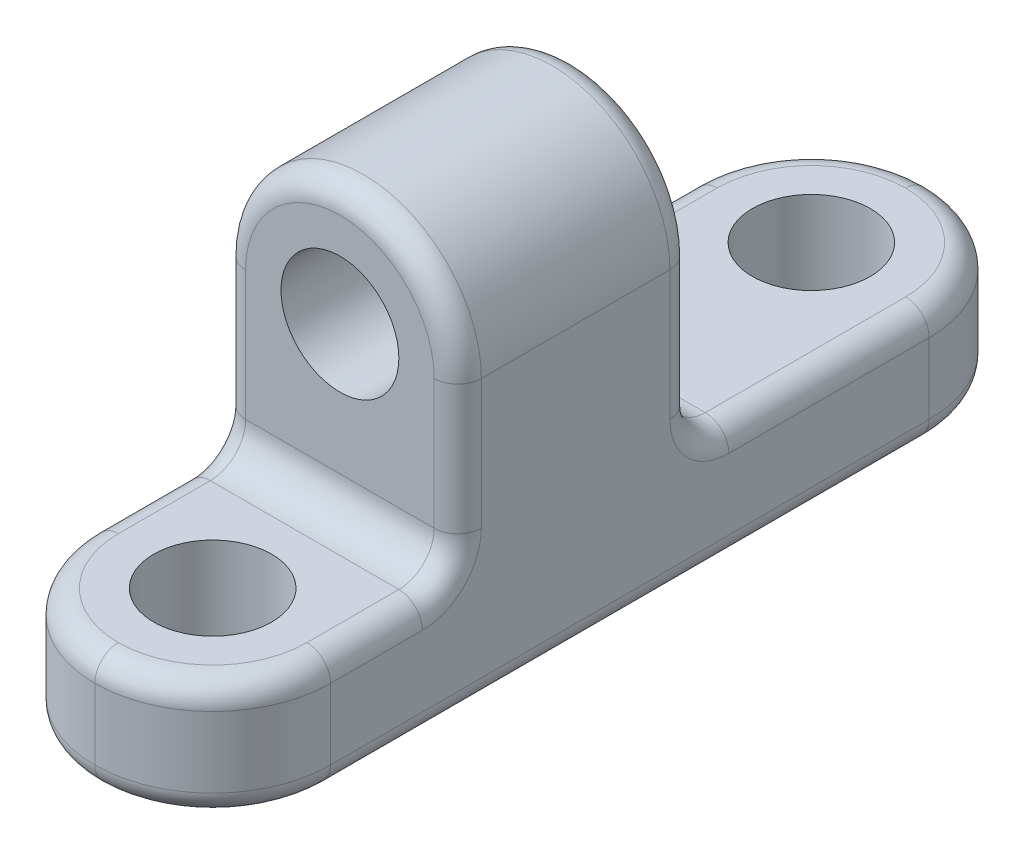
ISO-10303-21;
HEADER;
FILE_DESCRIPTION(('STEP AP214'),'2;1');
FILE_NAME('part.step','',(''),(''),'','','');
FILE_SCHEMA(('AUTOMOTIVE_DESIGN { 1 0 10303 214 1 1 1 1 }'));
ENDSEC;
DATA;
#1=APPLICATION_CONTEXT('core data for automotive mechanical design processes');
#2=APPLICATION_PROTOCOL_DEFINITION('international standard','automotive_design',2000,#1);
#3=PRODUCT_CONTEXT('',#1,'mechanical');
#4=PRODUCT('Part','Part','',(#3));
#5=PRODUCT_RELATED_PRODUCT_CATEGORY('part','',(#4));
#6=PRODUCT_DEFINITION_FORMATION('','',#4);
#7=PRODUCT_DEFINITION_CONTEXT('part definition',#1,'design');
#8=PRODUCT_DEFINITION('design','',#6,#7);
#9=PRODUCT_DEFINITION_SHAPE('','',#8);
#10=(LENGTH_UNIT() NAMED_UNIT(*) SI_UNIT(.MILLI.,.METRE.));
#11=(NAMED_UNIT(*) PLANE_ANGLE_UNIT() SI_UNIT($,.RADIAN.));
#12=(NAMED_UNIT(*) SI_UNIT($,.STERADIAN.) SOLID_ANGLE_UNIT());
#13=UNCERTAINTY_MEASURE_WITH_UNIT(LENGTH_MEASURE(1.E-05),#10,'distance_accuracy_value','');
#14=(GEOMETRIC_REPRESENTATION_CONTEXT(3) GLOBAL_UNCERTAINTY_ASSIGNED_CONTEXT((#13)) GLOBAL_UNIT_ASSIGNED_CONTEXT((#10,
#11,#12)) REPRESENTATION_CONTEXT('',''));
#15=CARTESIAN_POINT('',(0.,0.,0.));
#16=DIRECTION('',(0.,0.,1.));
#17=DIRECTION('',(1.,0.,0.));
#18=AXIS2_PLACEMENT_3D('',#15,#16,#17);
#19=CARTESIAN_POINT('',(0.,0.,10.));
#20=DIRECTION('',(0.,0.,1.));
#21=DIRECTION('',(1.,0.,0.));
#22=AXIS2_PLACEMENT_3D('',#19,#20,#21);
#23=PLANE('',#22);
#24=CARTESIAN_POINT('',(0.,0.,10.));
#25=DIRECTION('',(0.,0.,1.));
#26=DIRECTION('',(1.,0.,0.));
#27=AXIS2_PLACEMENT_3D('',#24,#25,#26);
#28=CIRCLE('',#27,2.5);
#29=CARTESIAN_POINT('',(2.5,0.,10.));
#30=VERTEX_POINT('',#29);
#31=EDGE_CURVE('E994',#30,#30,#28,.T.);
#32=ORIENTED_EDGE('',*,*,#31,.F.);
#33=EDGE_LOOP('',(#32));
#34=FACE_BOUND('',#33,.T.);
#35=DIRECTION('',(1.,0.,0.));
#36=VECTOR('',#35,1.);
#37=CARTESIAN_POINT('',(5.,-5.5,10.));
#38=LINE('',#37,#36);
#39=CARTESIAN_POINT('',(-4.,-5.5,10.));
#40=VERTEX_POINT('',#39);
#41=CARTESIAN_POINT('',(4.,-5.5,10.));
#42=VERTEX_POINT('',#41);
#43=EDGE_CURVE('E484',#40,#42,#38,.T.);
#44=ORIENTED_EDGE('',*,*,#43,.T.);
#45=DIRECTION('',(0.,-1.,0.));
#46=VECTOR('',#45,1.);
#47=CARTESIAN_POINT('',(4.,0.,10.));
#48=LINE('',#47,#46);
#49=CARTESIAN_POINT('',(4.,0.,10.));
#50=VERTEX_POINT('',#49);
#51=EDGE_CURVE('E311',#42,#50,#48,.F.);
#52=ORIENTED_EDGE('',*,*,#51,.T.);
#53=CARTESIAN_POINT('',(0.,0.,10.));
#54=DIRECTION('',(0.,0.,1.));
#55=DIRECTION('',(1.,0.,0.));
#56=AXIS2_PLACEMENT_3D('',#53,#54,#55);
#57=CIRCLE('',#56,4.);
#58=CARTESIAN_POINT('',(-4.,0.,10.));
#59=VERTEX_POINT('',#58);
#60=EDGE_CURVE('E308',#50,#59,#57,.T.);
#61=ORIENTED_EDGE('',*,*,#60,.T.);
#62=DIRECTION('',(0.,-1.,0.));
#63=VECTOR('',#62,1.);
#64=CARTESIAN_POINT('',(-4.,-5.5,10.));
#65=LINE('',#64,#63);
#66=EDGE_CURVE('E305',#59,#40,#65,.T.);
#67=ORIENTED_EDGE('',*,*,#66,.T.);
#68=EDGE_LOOP('',(#44,#52,#61,#67));
#69=FACE_BOUND('',#68,.T.);
#70=ADVANCED_FACE('F43',(#34,#69),#23,.T.);
#71=CARTESIAN_POINT('',(5.,0.,10.));
#72=DIRECTION('',(1.,0.,0.));
#73=DIRECTION('',(0.,1.,0.));
#74=AXIS2_PLACEMENT_3D('',#71,#72,#73);
#75=PLANE('',#74);
#76=DIRECTION('',(0.,-1.,0.));
#77=VECTOR('',#76,1.);
#78=CARTESIAN_POINT('',(5.,0.,15.4));
#79=LINE('',#78,#77);
#80=CARTESIAN_POINT('',(5.,-8.,15.4));
#81=VERTEX_POINT('',#80);
#82=CARTESIAN_POINT('',(5.,-11.,15.4));
#83=VERTEX_POINT('',#82);
#84=EDGE_CURVE('E470',#81,#83,#79,.T.);
#85=ORIENTED_EDGE('',*,*,#84,.T.);
#86=DIRECTION('',(0.,0.,-1.));
#87=VECTOR('',#86,1.);
#88=CARTESIAN_POINT('',(5.,-11.,10.));
#89=LINE('',#88,#87);
#90=CARTESIAN_POINT('',(5.,-11.,-10.));
#91=VERTEX_POINT('',#90);
#92=EDGE_CURVE('E271',#83,#91,#89,.T.);
#93=ORIENTED_EDGE('',*,*,#92,.T.);
#94=DIRECTION('',(0.,-1.,0.));
#95=VECTOR('',#94,1.);
#96=CARTESIAN_POINT('',(5.,0.,-10.));
#97=LINE('',#96,#95);
#98=CARTESIAN_POINT('',(5.,-8.,-10.));
#99=VERTEX_POINT('',#98);
#100=EDGE_CURVE('E464',#91,#99,#97,.F.);
#101=ORIENTED_EDGE('',*,*,#100,.T.);
#102=DIRECTION('',(0.,0.,1.));
#103=VECTOR('',#102,1.);
#104=CARTESIAN_POINT('',(5.,-8.,-1.5));
#105=LINE('',#104,#103);
#106=CARTESIAN_POINT('',(5.,-8.,-1.5));
#107=VERTEX_POINT('',#106);
#108=EDGE_CURVE('E253',#99,#107,#105,.T.);
#109=ORIENTED_EDGE('',*,*,#108,.T.);
#110=CARTESIAN_POINT('',(5.,-5.5,-1.5));
#111=DIRECTION('',(1.,0.,0.));
#112=DIRECTION('',(0.,1.,0.));
#113=AXIS2_PLACEMENT_3D('',#110,#111,#112);
#114=CIRCLE('',#113,2.5);
#115=CARTESIAN_POINT('',(5.,-5.5,1.));
#116=VERTEX_POINT('',#115);
#117=EDGE_CURVE('E256',#107,#116,#114,.F.);
#118=ORIENTED_EDGE('',*,*,#117,.T.);
#119=DIRECTION('',(0.,-1.,0.));
#120=VECTOR('',#119,1.);
#121=CARTESIAN_POINT('',(5.,0.,1.));
#122=LINE('',#121,#120);
#123=CARTESIAN_POINT('',(5.,0.,0.999999999999999));
#124=VERTEX_POINT('',#123);
#125=EDGE_CURVE('E259',#116,#124,#122,.F.);
#126=ORIENTED_EDGE('',*,*,#125,.T.);
#127=DIRECTION('',(0.,0.,-1.));
#128=VECTOR('',#127,1.);
#129=CARTESIAN_POINT('',(5.,0.,10.));
#130=LINE('',#129,#128);
#131=CARTESIAN_POINT('',(5.,0.,9.));
#132=VERTEX_POINT('',#131);
#133=EDGE_CURVE('E477',#132,#124,#130,.T.);
#134=ORIENTED_EDGE('',*,*,#133,.F.);
#135=DIRECTION('',(0.,-1.,0.));
#136=VECTOR('',#135,1.);
#137=CARTESIAN_POINT('',(5.,0.,9.));
#138=LINE('',#137,#136);
#139=CARTESIAN_POINT('',(5.,-5.5,9.));
#140=VERTEX_POINT('',#139);
#141=EDGE_CURVE('E262',#132,#140,#138,.T.);
#142=ORIENTED_EDGE('',*,*,#141,.T.);
#143=CARTESIAN_POINT('',(5.,-5.5,11.5));
#144=DIRECTION('',(1.,0.,0.));
#145=DIRECTION('',(0.,1.,0.));
#146=AXIS2_PLACEMENT_3D('',#143,#144,#145);
#147=CIRCLE('',#146,2.5);
#148=CARTESIAN_POINT('',(5.,-8.,11.5));
#149=VERTEX_POINT('',#148);
#150=EDGE_CURVE('E265',#140,#149,#147,.F.);
#151=ORIENTED_EDGE('',*,*,#150,.T.);
#152=DIRECTION('',(0.,0.,1.));
#153=VECTOR('',#152,1.);
#154=CARTESIAN_POINT('',(5.,-8.,10.));
#155=LINE('',#154,#153);
#156=EDGE_CURVE('E268',#149,#81,#155,.T.);
#157=ORIENTED_EDGE('',*,*,#156,.T.);
#158=EDGE_LOOP('',(#85,#93,#101,#109,#118,#126,#134,#142,#151,#157));
#159=FACE_BOUND('',#158,.T.);
#160=ADVANCED_FACE('F459',(#159),#75,.T.);
#161=CARTESIAN_POINT('',(0.,0.,10.));
#162=DIRECTION('',(0.,0.,-1.));
#163=DIRECTION('',(-1.,0.,0.));
#164=AXIS2_PLACEMENT_3D('',#161,#162,#163);
#165=CYLINDRICAL_SURFACE('',#164,5.);
#166=DIRECTION('',(0.,0.,-1.));
#167=VECTOR('',#166,1.);
#168=CARTESIAN_POINT('',(-5.,0.,10.));
#169=LINE('',#168,#167);
#170=CARTESIAN_POINT('',(-5.,0.,9.));
#171=VERTEX_POINT('',#170);
#172=CARTESIAN_POINT('',(-5.,0.,0.999999999999999));
#173=VERTEX_POINT('',#172);
#174=EDGE_CURVE('E1004',#171,#173,#169,.T.);
#175=ORIENTED_EDGE('',*,*,#174,.F.);
#176=CARTESIAN_POINT('',(0.,0.,9.));
#177=DIRECTION('',(0.,0.,1.));
#178=DIRECTION('',(1.,0.,0.));
#179=AXIS2_PLACEMENT_3D('',#176,#177,#178);
#180=CIRCLE('',#179,5.);
#181=EDGE_CURVE('E317',#171,#132,#180,.F.);
#182=ORIENTED_EDGE('',*,*,#181,.T.);
#183=ORIENTED_EDGE('',*,*,#133,.T.);
#184=CARTESIAN_POINT('',(0.,0.,0.999999999999999));
#185=DIRECTION('',(0.,0.,1.));
#186=DIRECTION('',(1.,0.,0.));
#187=AXIS2_PLACEMENT_3D('',#184,#185,#186);
#188=CIRCLE('',#187,5.);
#189=EDGE_CURVE('E314',#124,#173,#188,.T.);
#190=ORIENTED_EDGE('',*,*,#189,.T.);
#191=EDGE_LOOP('',(#175,#182,#183,#190));
#192=FACE_BOUND('',#191,.T.);
#193=ADVANCED_FACE('F602',(#192),#165,.T.);
#194=CARTESIAN_POINT('',(-5.,0.,10.));
#195=DIRECTION('',(1.,0.,0.));
#196=DIRECTION('',(0.,1.,0.));
#197=AXIS2_PLACEMENT_3D('',#194,#195,#196);
#198=PLANE('',#197);
#199=DIRECTION('',(0.,-1.,0.));
#200=VECTOR('',#199,1.);
#201=CARTESIAN_POINT('',(-5.,-12.,-10.));
#202=LINE('',#201,#200);
#203=CARTESIAN_POINT('',(-5.,-8.,-10.));
#204=VERTEX_POINT('',#203);
#205=CARTESIAN_POINT('',(-5.,-11.,-10.));
#206=VERTEX_POINT('',#205);
#207=EDGE_CURVE('E469',#204,#206,#202,.T.);
#208=ORIENTED_EDGE('',*,*,#207,.T.);
#209=DIRECTION('',(0.,0.,-1.));
#210=VECTOR('',#209,1.);
#211=CARTESIAN_POINT('',(-5.,-11.,15.4));
#212=LINE('',#211,#210);
#213=CARTESIAN_POINT('',(-5.,-11.,15.4));
#214=VERTEX_POINT('',#213);
#215=EDGE_CURVE('E339',#206,#214,#212,.F.);
#216=ORIENTED_EDGE('',*,*,#215,.T.);
#217=DIRECTION('',(0.,-1.,0.));
#218=VECTOR('',#217,1.);
#219=CARTESIAN_POINT('',(-5.,-7.,15.4));
#220=LINE('',#219,#218);
#221=CARTESIAN_POINT('',(-5.,-8.,15.4));
#222=VERTEX_POINT('',#221);
#223=EDGE_CURVE('E475',#214,#222,#220,.F.);
#224=ORIENTED_EDGE('',*,*,#223,.T.);
#225=DIRECTION('',(0.,0.,-1.));
#226=VECTOR('',#225,1.);
#227=CARTESIAN_POINT('',(-5.,-8.,11.5));
#228=LINE('',#227,#226);
#229=CARTESIAN_POINT('',(-5.,-8.,11.5));
#230=VERTEX_POINT('',#229);
#231=EDGE_CURVE('E330',#222,#230,#228,.T.);
#232=ORIENTED_EDGE('',*,*,#231,.T.);
#233=CARTESIAN_POINT('',(-5.,-5.5,11.5));
#234=DIRECTION('',(1.,0.,0.));
#235=DIRECTION('',(0.,1.,0.));
#236=AXIS2_PLACEMENT_3D('',#233,#234,#235);
#237=CIRCLE('',#236,2.5);
#238=CARTESIAN_POINT('',(-5.,-5.5,9.));
#239=VERTEX_POINT('',#238);
#240=EDGE_CURVE('E333',#230,#239,#237,.T.);
#241=ORIENTED_EDGE('',*,*,#240,.T.);
#242=DIRECTION('',(0.,-1.,0.));
#243=VECTOR('',#242,1.);
#244=CARTESIAN_POINT('',(-5.,0.,9.));
#245=LINE('',#244,#243);
#246=EDGE_CURVE('E336',#239,#171,#245,.F.);
#247=ORIENTED_EDGE('',*,*,#246,.T.);
#248=ORIENTED_EDGE('',*,*,#174,.T.);
#249=DIRECTION('',(0.,-1.,0.));
#250=VECTOR('',#249,1.);
#251=CARTESIAN_POINT('',(-5.,0.,0.999999999999999));
#252=LINE('',#251,#250);
#253=CARTESIAN_POINT('',(-5.,-5.5,1.));
#254=VERTEX_POINT('',#253);
#255=EDGE_CURVE('E327',#173,#254,#252,.T.);
#256=ORIENTED_EDGE('',*,*,#255,.T.);
#257=CARTESIAN_POINT('',(-5.,-5.5,-1.5));
#258=DIRECTION('',(1.,0.,0.));
#259=DIRECTION('',(0.,1.,0.));
#260=AXIS2_PLACEMENT_3D('',#257,#258,#259);
#261=CIRCLE('',#260,2.5);
#262=CARTESIAN_POINT('',(-5.,-8.,-1.5));
#263=VERTEX_POINT('',#262);
#264=EDGE_CURVE('E323',#254,#263,#261,.T.);
#265=ORIENTED_EDGE('',*,*,#264,.T.);
#266=DIRECTION('',(0.,0.,-1.));
#267=VECTOR('',#266,1.);
#268=CARTESIAN_POINT('',(-5.,-8.,10.));
#269=LINE('',#268,#267);
#270=EDGE_CURVE('E320',#263,#204,#269,.T.);
#271=ORIENTED_EDGE('',*,*,#270,.T.);
#272=EDGE_LOOP('',(#208,#216,#224,#232,#241,#247,#248,#256,#265,#271));
#273=FACE_BOUND('',#272,.T.);
#274=ADVANCED_FACE('F540',(#273),#198,.F.);
#275=CARTESIAN_POINT('',(0.,0.,10.));
#276=DIRECTION('',(0.,0.,-1.));
#277=DIRECTION('',(-1.,0.,0.));
#278=AXIS2_PLACEMENT_3D('',#275,#276,#277);
#279=CYLINDRICAL_SURFACE('',#278,2.5);
#280=ORIENTED_EDGE('',*,*,#31,.T.);
#281=EDGE_LOOP('',(#280));
#282=FACE_BOUND('',#281,.T.);
#283=CARTESIAN_POINT('',(0.,0.,0.));
#284=DIRECTION('',(0.,0.,1.));
#285=DIRECTION('',(1.,0.,0.));
#286=AXIS2_PLACEMENT_3D('',#283,#284,#285);
#287=CIRCLE('',#286,2.5);
#288=CARTESIAN_POINT('',(2.5,0.,0.));
#289=VERTEX_POINT('',#288);
#290=EDGE_CURVE('E988',#289,#289,#287,.T.);
#291=ORIENTED_EDGE('',*,*,#290,.F.);
#292=EDGE_LOOP('',(#291));
#293=FACE_BOUND('',#292,.T.);
#294=ADVANCED_FACE('F614',(#282,#293),#279,.F.);
#295=CARTESIAN_POINT('',(0.,-12.,10.));
#296=DIRECTION('',(0.,-1.,0.));
#297=DIRECTION('',(0.,0.,-1.));
#298=AXIS2_PLACEMENT_3D('',#295,#296,#297);
#299=PLANE('',#298);
#300=CARTESIAN_POINT('',(0.,-12.,15.4));
#301=DIRECTION('',(0.,-1.,0.));
#302=DIRECTION('',(0.,0.,-1.));
#303=AXIS2_PLACEMENT_3D('',#300,#301,#302);
#304=CIRCLE('',#303,4.);
#305=CARTESIAN_POINT('',(4.,-12.,15.4));
#306=VERTEX_POINT('',#305);
#307=CARTESIAN_POINT('',(0.,-12.,19.4));
#308=VERTEX_POINT('',#307);
#309=EDGE_CURVE('E232',#306,#308,#304,.T.);
#310=ORIENTED_EDGE('',*,*,#309,.T.);
#311=CARTESIAN_POINT('',(0.,-12.,15.4));
#312=DIRECTION('',(0.,-1.,0.));
#313=DIRECTION('',(0.,0.,-1.));
#314=AXIS2_PLACEMENT_3D('',#311,#312,#313);
#315=CIRCLE('',#314,4.);
#316=CARTESIAN_POINT('',(-4.,-12.,15.4));
#317=VERTEX_POINT('',#316);
#318=EDGE_CURVE('E209',#308,#317,#315,.T.);
#319=ORIENTED_EDGE('',*,*,#318,.T.);
#320=DIRECTION('',(0.,0.,-1.));
#321=VECTOR('',#320,1.);
#322=CARTESIAN_POINT('',(-4.,-12.,-10.));
#323=LINE('',#322,#321);
#324=CARTESIAN_POINT('',(-4.,-12.,-10.));
#325=VERTEX_POINT('',#324);
#326=EDGE_CURVE('E219',#317,#325,#323,.T.);
#327=ORIENTED_EDGE('',*,*,#326,.T.);
#328=CARTESIAN_POINT('',(0.,-12.,-10.));
#329=DIRECTION('',(0.,-1.,0.));
#330=DIRECTION('',(0.,0.,-1.));
#331=AXIS2_PLACEMENT_3D('',#328,#329,#330);
#332=CIRCLE('',#331,4.);
#333=CARTESIAN_POINT('',(0.,-12.,-14.));
#334=VERTEX_POINT('',#333);
#335=EDGE_CURVE('E226',#325,#334,#332,.T.);
#336=ORIENTED_EDGE('',*,*,#335,.T.);
#337=CARTESIAN_POINT('',(0.,-12.,-10.));
#338=DIRECTION('',(0.,-1.,0.));
#339=DIRECTION('',(0.,0.,-1.));
#340=AXIS2_PLACEMENT_3D('',#337,#338,#339);
#341=CIRCLE('',#340,4.);
#342=CARTESIAN_POINT('',(4.,-12.,-10.));
#343=VERTEX_POINT('',#342);
#344=EDGE_CURVE('E508',#334,#343,#341,.T.);
#345=ORIENTED_EDGE('',*,*,#344,.T.);
#346=DIRECTION('',(0.,0.,-1.));
#347=VECTOR('',#346,1.);
#348=CARTESIAN_POINT('',(4.,-12.,10.));
#349=LINE('',#348,#347);
#350=EDGE_CURVE('E241',#343,#306,#349,.F.);
#351=ORIENTED_EDGE('',*,*,#350,.T.);
#352=EDGE_LOOP('',(#310,#319,#327,#336,#345,#351));
#353=FACE_BOUND('',#352,.T.);
#354=CARTESIAN_POINT('',(0.,-12.,-10.));
#355=DIRECTION('',(0.,-1.,0.));
#356=DIRECTION('',(0.,0.,-1.));
#357=AXIS2_PLACEMENT_3D('',#354,#355,#356);
#358=CIRCLE('',#357,2.5);
#359=CARTESIAN_POINT('',(0.,-12.,-12.5));
#360=VERTEX_POINT('',#359);
#361=EDGE_CURVE('E989',#360,#360,#358,.T.);
#362=ORIENTED_EDGE('',*,*,#361,.F.);
#363=EDGE_LOOP('',(#362));
#364=FACE_BOUND('',#363,.T.);
#365=CARTESIAN_POINT('',(0.,-12.,15.4));
#366=DIRECTION('',(0.,-1.,0.));
#367=DIRECTION('',(0.,0.,-1.));
#368=AXIS2_PLACEMENT_3D('',#365,#366,#367);
#369=CIRCLE('',#368,2.5);
#370=CARTESIAN_POINT('',(0.,-12.,12.9));
#371=VERTEX_POINT('',#370);
#372=EDGE_CURVE('E489',#371,#371,#369,.T.);
#373=ORIENTED_EDGE('',*,*,#372,.F.);
#374=EDGE_LOOP('',(#373));
#375=FACE_BOUND('',#374,.T.);
#376=ADVANCED_FACE('F229',(#353,#364,#375),#299,.T.);
#377=CARTESIAN_POINT('',(0.,0.,0.));
#378=DIRECTION('',(0.,0.,1.));
#379=DIRECTION('',(1.,0.,0.));
#380=AXIS2_PLACEMENT_3D('',#377,#378,#379);
#381=PLANE('',#380);
#382=ORIENTED_EDGE('',*,*,#290,.T.);
#383=EDGE_LOOP('',(#382));
#384=FACE_BOUND('',#383,.T.);
#385=DIRECTION('',(-1.,0.,0.));
#386=VECTOR('',#385,1.);
#387=CARTESIAN_POINT('',(-5.,-5.5,0.));
#388=LINE('',#387,#386);
#389=CARTESIAN_POINT('',(4.,-5.5,0.));
#390=VERTEX_POINT('',#389);
#391=CARTESIAN_POINT('',(-4.,-5.5,0.));
#392=VERTEX_POINT('',#391);
#393=EDGE_CURVE('E500',#390,#392,#388,.T.);
#394=ORIENTED_EDGE('',*,*,#393,.T.);
#395=DIRECTION('',(0.,-1.,0.));
#396=VECTOR('',#395,1.);
#397=CARTESIAN_POINT('',(-4.,0.,0.));
#398=LINE('',#397,#396);
#399=CARTESIAN_POINT('',(-4.,0.,0.));
#400=VERTEX_POINT('',#399);
#401=EDGE_CURVE('E355',#392,#400,#398,.F.);
#402=ORIENTED_EDGE('',*,*,#401,.T.);
#403=CARTESIAN_POINT('',(0.,0.,0.));
#404=DIRECTION('',(0.,0.,1.));
#405=DIRECTION('',(1.,0.,0.));
#406=AXIS2_PLACEMENT_3D('',#403,#404,#405);
#407=CIRCLE('',#406,4.);
#408=CARTESIAN_POINT('',(4.,0.,0.));
#409=VERTEX_POINT('',#408);
#410=EDGE_CURVE('E352',#400,#409,#407,.F.);
#411=ORIENTED_EDGE('',*,*,#410,.T.);
#412=DIRECTION('',(0.,-1.,0.));
#413=VECTOR('',#412,1.);
#414=CARTESIAN_POINT('',(4.,-5.5,0.));
#415=LINE('',#414,#413);
#416=EDGE_CURVE('E349',#409,#390,#415,.T.);
#417=ORIENTED_EDGE('',*,*,#416,.T.);
#418=EDGE_LOOP('',(#394,#402,#411,#417));
#419=FACE_BOUND('',#418,.T.);
#420=ADVANCED_FACE('F581',(#384,#419),#381,.F.);
#421=CARTESIAN_POINT('',(0.,-7.,0.));
#422=DIRECTION('',(0.,-1.,0.));
#423=DIRECTION('',(0.,0.,-1.));
#424=AXIS2_PLACEMENT_3D('',#421,#422,#423);
#425=PLANE('',#424);
#426=CARTESIAN_POINT('',(0.,-7.,-10.));
#427=DIRECTION('',(0.,-1.,0.));
#428=DIRECTION('',(0.,0.,-1.));
#429=AXIS2_PLACEMENT_3D('',#426,#427,#428);
#430=CIRCLE('',#429,2.5);
#431=CARTESIAN_POINT('',(0.,-7.,-12.5));
#432=VERTEX_POINT('',#431);
#433=EDGE_CURVE('E986',#432,#432,#430,.T.);
#434=ORIENTED_EDGE('',*,*,#433,.T.);
#435=EDGE_LOOP('',(#434));
#436=FACE_BOUND('',#435,.T.);
#437=DIRECTION('',(-1.,0.,0.));
#438=VECTOR('',#437,1.);
#439=CARTESIAN_POINT('',(5.,-7.,-1.5));
#440=LINE('',#439,#438);
#441=CARTESIAN_POINT('',(-4.,-7.,-1.5));
#442=VERTEX_POINT('',#441);
#443=CARTESIAN_POINT('',(4.,-7.,-1.5));
#444=VERTEX_POINT('',#443);
#445=EDGE_CURVE('E227',#442,#444,#440,.F.);
#446=ORIENTED_EDGE('',*,*,#445,.T.);
#447=DIRECTION('',(0.,0.,1.));
#448=VECTOR('',#447,1.);
#449=CARTESIAN_POINT('',(4.,-7.,-10.));
#450=LINE('',#449,#448);
#451=CARTESIAN_POINT('',(4.,-7.,-10.));
#452=VERTEX_POINT('',#451);
#453=EDGE_CURVE('E11',#444,#452,#450,.F.);
#454=ORIENTED_EDGE('',*,*,#453,.T.);
#455=CARTESIAN_POINT('',(0.,-7.,-10.));
#456=DIRECTION('',(0.,-1.,0.));
#457=DIRECTION('',(0.,0.,-1.));
#458=AXIS2_PLACEMENT_3D('',#455,#456,#457);
#459=CIRCLE('',#458,4.);
#460=CARTESIAN_POINT('',(0.,-7.,-14.));
#461=VERTEX_POINT('',#460);
#462=EDGE_CURVE('E53',#452,#461,#459,.F.);
#463=ORIENTED_EDGE('',*,*,#462,.T.);
#464=CARTESIAN_POINT('',(0.,-7.,-10.));
#465=DIRECTION('',(0.,-1.,0.));
#466=DIRECTION('',(0.,0.,-1.));
#467=AXIS2_PLACEMENT_3D('',#464,#465,#466);
#468=CIRCLE('',#467,4.);
#469=CARTESIAN_POINT('',(-4.,-7.,-10.));
#470=VERTEX_POINT('',#469);
#471=EDGE_CURVE('E361',#461,#470,#468,.F.);
#472=ORIENTED_EDGE('',*,*,#471,.T.);
#473=DIRECTION('',(0.,0.,-1.));
#474=VECTOR('',#473,1.);
#475=CARTESIAN_POINT('',(-4.,-7.,0.));
#476=LINE('',#475,#474);
#477=EDGE_CURVE('E358',#470,#442,#476,.F.);
#478=ORIENTED_EDGE('',*,*,#477,.T.);
#479=EDGE_LOOP('',(#446,#454,#463,#472,#478));
#480=FACE_BOUND('',#479,.T.);
#481=ADVANCED_FACE('F565',(#436,#480),#425,.F.);
#482=CARTESIAN_POINT('',(0.,-7.,-10.));
#483=DIRECTION('',(0.,-1.,0.));
#484=DIRECTION('',(0.,0.,-1.));
#485=AXIS2_PLACEMENT_3D('',#482,#483,#484);
#486=CYLINDRICAL_SURFACE('',#485,2.5);
#487=ORIENTED_EDGE('',*,*,#433,.F.);
#488=EDGE_LOOP('',(#487));
#489=FACE_BOUND('',#488,.T.);
#490=ORIENTED_EDGE('',*,*,#361,.T.);
#491=EDGE_LOOP('',(#490));
#492=FACE_BOUND('',#491,.T.);
#493=ADVANCED_FACE('F871',(#489,#492),#486,.F.);
#494=CARTESIAN_POINT('',(0.,-7.,0.));
#495=DIRECTION('',(0.,1.,0.));
#496=DIRECTION('',(0.,0.,1.));
#497=AXIS2_PLACEMENT_3D('',#494,#495,#496);
#498=PLANE('',#497);
#499=CARTESIAN_POINT('',(0.,-7.,15.4));
#500=DIRECTION('',(0.,-1.,0.));
#501=DIRECTION('',(0.,0.,-1.));
#502=AXIS2_PLACEMENT_3D('',#499,#500,#501);
#503=CIRCLE('',#502,2.5);
#504=CARTESIAN_POINT('',(0.,-7.,12.9));
#505=VERTEX_POINT('',#504);
#506=EDGE_CURVE('E997',#505,#505,#503,.T.);
#507=ORIENTED_EDGE('',*,*,#506,.T.);
#508=EDGE_LOOP('',(#507));
#509=FACE_BOUND('',#508,.T.);
#510=CARTESIAN_POINT('',(0.,-7.,15.4));
#511=DIRECTION('',(0.,1.,0.));
#512=DIRECTION('',(0.,0.,1.));
#513=AXIS2_PLACEMENT_3D('',#510,#511,#512);
#514=CIRCLE('',#513,4.);
#515=CARTESIAN_POINT('',(0.,-7.,19.4));
#516=VERTEX_POINT('',#515);
#517=CARTESIAN_POINT('',(4.,-7.,15.4));
#518=VERTEX_POINT('',#517);
#519=EDGE_CURVE('E293',#516,#518,#514,.T.);
#520=ORIENTED_EDGE('',*,*,#519,.T.);
#521=DIRECTION('',(0.,0.,1.));
#522=VECTOR('',#521,1.);
#523=CARTESIAN_POINT('',(4.,-7.,0.));
#524=LINE('',#523,#522);
#525=CARTESIAN_POINT('',(4.,-7.,11.5));
#526=VERTEX_POINT('',#525);
#527=EDGE_CURVE('E296',#518,#526,#524,.F.);
#528=ORIENTED_EDGE('',*,*,#527,.T.);
#529=DIRECTION('',(1.,0.,0.));
#530=VECTOR('',#529,1.);
#531=CARTESIAN_POINT('',(-5.,-7.,11.5));
#532=LINE('',#531,#530);
#533=CARTESIAN_POINT('',(-4.,-7.,11.5));
#534=VERTEX_POINT('',#533);
#535=EDGE_CURVE('E496',#526,#534,#532,.F.);
#536=ORIENTED_EDGE('',*,*,#535,.T.);
#537=DIRECTION('',(0.,0.,-1.));
#538=VECTOR('',#537,1.);
#539=CARTESIAN_POINT('',(-4.,-7.,15.4));
#540=LINE('',#539,#538);
#541=CARTESIAN_POINT('',(-4.,-7.,15.4));
#542=VERTEX_POINT('',#541);
#543=EDGE_CURVE('E286',#534,#542,#540,.F.);
#544=ORIENTED_EDGE('',*,*,#543,.T.);
#545=CARTESIAN_POINT('',(0.,-7.,15.4));
#546=DIRECTION('',(0.,1.,0.));
#547=DIRECTION('',(0.,0.,1.));
#548=AXIS2_PLACEMENT_3D('',#545,#546,#547);
#549=CIRCLE('',#548,4.);
#550=EDGE_CURVE('E289',#542,#516,#549,.T.);
#551=ORIENTED_EDGE('',*,*,#550,.T.);
#552=EDGE_LOOP('',(#520,#528,#536,#544,#551));
#553=FACE_BOUND('',#552,.T.);
#554=ADVANCED_FACE('F862',(#509,#553),#498,.T.);
#555=CARTESIAN_POINT('',(0.,-7.,15.4));
#556=DIRECTION('',(0.,-1.,0.));
#557=DIRECTION('',(0.,0.,-1.));
#558=AXIS2_PLACEMENT_3D('',#555,#556,#557);
#559=CYLINDRICAL_SURFACE('',#558,2.5);
#560=ORIENTED_EDGE('',*,*,#506,.F.);
#561=EDGE_LOOP('',(#560));
#562=FACE_BOUND('',#561,.T.);
#563=ORIENTED_EDGE('',*,*,#372,.T.);
#564=EDGE_LOOP('',(#563));
#565=FACE_BOUND('',#564,.T.);
#566=ADVANCED_FACE('F627',(#562,#565),#559,.F.);
#567=CARTESIAN_POINT('',(0.,0.,-10.));
#568=DIRECTION('',(0.,1.,0.));
#569=DIRECTION('',(-1.,0.,0.));
#570=AXIS2_PLACEMENT_3D('',#567,#568,#569);
#571=CYLINDRICAL_SURFACE('',#570,5.);
#572=DIRECTION('',(0.,-1.,0.));
#573=VECTOR('',#572,1.);
#574=CARTESIAN_POINT('',(0.,-7.,-15.));
#575=LINE('',#574,#573);
#576=CARTESIAN_POINT('',(0.,-11.,-15.));
#577=VERTEX_POINT('',#576);
#578=CARTESIAN_POINT('',(0.,-8.,-15.));
#579=VERTEX_POINT('',#578);
#580=EDGE_CURVE('E485',#577,#579,#575,.F.);
#581=ORIENTED_EDGE('',*,*,#580,.F.);
#582=CARTESIAN_POINT('',(0.,-11.,-10.));
#583=DIRECTION('',(0.,-1.,0.));
#584=DIRECTION('',(0.,0.,-1.));
#585=AXIS2_PLACEMENT_3D('',#582,#583,#584);
#586=CIRCLE('',#585,5.);
#587=EDGE_CURVE('E283',#577,#206,#586,.F.);
#588=ORIENTED_EDGE('',*,*,#587,.T.);
#589=ORIENTED_EDGE('',*,*,#207,.F.);
#590=CARTESIAN_POINT('',(0.,-8.,-10.));
#591=DIRECTION('',(0.,-1.,0.));
#592=DIRECTION('',(0.,0.,-1.));
#593=AXIS2_PLACEMENT_3D('',#590,#591,#592);
#594=CIRCLE('',#593,5.);
#595=EDGE_CURVE('E280',#204,#579,#594,.T.);
#596=ORIENTED_EDGE('',*,*,#595,.T.);
#597=EDGE_LOOP('',(#581,#588,#589,#596));
#598=FACE_BOUND('',#597,.T.);
#599=ADVANCED_FACE('F555',(#598),#571,.T.);
#600=CARTESIAN_POINT('',(0.,-7.,-10.));
#601=DIRECTION('',(0.,-1.,0.));
#602=DIRECTION('',(1.,0.,0.));
#603=AXIS2_PLACEMENT_3D('',#600,#601,#602);
#604=CYLINDRICAL_SURFACE('',#603,5.);
#605=ORIENTED_EDGE('',*,*,#100,.F.);
#606=CARTESIAN_POINT('',(0.,-11.,-10.));
#607=DIRECTION('',(0.,-1.,0.));
#608=DIRECTION('',(0.,0.,-1.));
#609=AXIS2_PLACEMENT_3D('',#606,#607,#608);
#610=CIRCLE('',#609,5.);
#611=EDGE_CURVE('E277',#91,#577,#610,.F.);
#612=ORIENTED_EDGE('',*,*,#611,.T.);
#613=ORIENTED_EDGE('',*,*,#580,.T.);
#614=CARTESIAN_POINT('',(0.,-8.,-10.));
#615=DIRECTION('',(0.,-1.,0.));
#616=DIRECTION('',(0.,0.,-1.));
#617=AXIS2_PLACEMENT_3D('',#614,#615,#616);
#618=CIRCLE('',#617,5.);
#619=EDGE_CURVE('E274',#579,#99,#618,.T.);
#620=ORIENTED_EDGE('',*,*,#619,.T.);
#621=EDGE_LOOP('',(#605,#612,#613,#620));
#622=FACE_BOUND('',#621,.T.);
#623=ADVANCED_FACE('F553',(#622),#604,.T.);
#624=CARTESIAN_POINT('',(0.,-7.,15.4));
#625=DIRECTION('',(0.,1.,0.));
#626=DIRECTION('',(-1.,0.,0.));
#627=AXIS2_PLACEMENT_3D('',#624,#625,#626);
#628=CYLINDRICAL_SURFACE('',#627,5.);
#629=ORIENTED_EDGE('',*,*,#223,.F.);
#630=CARTESIAN_POINT('',(0.,-11.,15.4));
#631=DIRECTION('',(0.,-1.,0.));
#632=DIRECTION('',(0.,0.,-1.));
#633=AXIS2_PLACEMENT_3D('',#630,#631,#632);
#634=CIRCLE('',#633,5.);
#635=CARTESIAN_POINT('',(0.,-11.,20.4));
#636=VERTEX_POINT('',#635);
#637=EDGE_CURVE('E211',#214,#636,#634,.F.);
#638=ORIENTED_EDGE('',*,*,#637,.T.);
#639=DIRECTION('',(0.,-1.,0.));
#640=VECTOR('',#639,1.);
#641=CARTESIAN_POINT('',(0.,-12.,20.4));
#642=LINE('',#641,#640);
#643=CARTESIAN_POINT('',(0.,-8.,20.4));
#644=VERTEX_POINT('',#643);
#645=EDGE_CURVE('E382',#644,#636,#642,.T.);
#646=ORIENTED_EDGE('',*,*,#645,.F.);
#647=CARTESIAN_POINT('',(0.,-8.,15.4));
#648=DIRECTION('',(0.,1.,0.));
#649=DIRECTION('',(0.,0.,1.));
#650=AXIS2_PLACEMENT_3D('',#647,#648,#649);
#651=CIRCLE('',#650,5.);
#652=EDGE_CURVE('E235',#644,#222,#651,.F.);
#653=ORIENTED_EDGE('',*,*,#652,.T.);
#654=EDGE_LOOP('',(#629,#638,#646,#653));
#655=FACE_BOUND('',#654,.T.);
#656=ADVANCED_FACE('F525',(#655),#628,.T.);
#657=CARTESIAN_POINT('',(0.,0.,15.4));
#658=DIRECTION('',(0.,-1.,0.));
#659=DIRECTION('',(1.,0.,0.));
#660=AXIS2_PLACEMENT_3D('',#657,#658,#659);
#661=CYLINDRICAL_SURFACE('',#660,5.);
#662=ORIENTED_EDGE('',*,*,#645,.T.);
#663=CARTESIAN_POINT('',(0.,-11.,15.4));
#664=DIRECTION('',(0.,-1.,0.));
#665=DIRECTION('',(0.,0.,-1.));
#666=AXIS2_PLACEMENT_3D('',#663,#664,#665);
#667=CIRCLE('',#666,5.);
#668=EDGE_CURVE('E250',#636,#83,#667,.F.);
#669=ORIENTED_EDGE('',*,*,#668,.T.);
#670=ORIENTED_EDGE('',*,*,#84,.F.);
#671=CARTESIAN_POINT('',(0.,-8.,15.4));
#672=DIRECTION('',(0.,1.,0.));
#673=DIRECTION('',(0.,0.,1.));
#674=AXIS2_PLACEMENT_3D('',#671,#672,#673);
#675=CIRCLE('',#674,5.);
#676=EDGE_CURVE('E247',#81,#644,#675,.F.);
#677=ORIENTED_EDGE('',*,*,#676,.T.);
#678=EDGE_LOOP('',(#662,#669,#670,#677));
#679=FACE_BOUND('',#678,.T.);
#680=ADVANCED_FACE('F527',(#679),#661,.T.);
#681=CARTESIAN_POINT('',(0.,-5.5,11.5));
#682=DIRECTION('',(-1.,0.,0.));
#683=DIRECTION('',(0.,0.,1.));
#684=AXIS2_PLACEMENT_3D('',#681,#682,#683);
#685=CYLINDRICAL_SURFACE('',#684,1.5);
#686=ORIENTED_EDGE('',*,*,#535,.F.);
#687=CARTESIAN_POINT('',(4.,-5.5,11.5));
#688=DIRECTION('',(1.,0.,0.));
#689=DIRECTION('',(0.,1.,0.));
#690=AXIS2_PLACEMENT_3D('',#687,#688,#689);
#691=CIRCLE('',#690,1.5);
#692=EDGE_CURVE('E302',#526,#42,#691,.T.);
#693=ORIENTED_EDGE('',*,*,#692,.T.);
#694=ORIENTED_EDGE('',*,*,#43,.F.);
#695=CARTESIAN_POINT('',(-4.,-5.5,11.5));
#696=DIRECTION('',(1.,0.,0.));
#697=DIRECTION('',(0.,1.,0.));
#698=AXIS2_PLACEMENT_3D('',#695,#696,#697);
#699=CIRCLE('',#698,1.5);
#700=EDGE_CURVE('E299',#40,#534,#699,.F.);
#701=ORIENTED_EDGE('',*,*,#700,.T.);
#702=EDGE_LOOP('',(#686,#693,#694,#701));
#703=FACE_BOUND('',#702,.T.);
#704=ADVANCED_FACE('F630',(#703),#685,.F.);
#705=CARTESIAN_POINT('',(0.,-5.5,-1.5));
#706=DIRECTION('',(1.,0.,0.));
#707=DIRECTION('',(0.,0.,-1.));
#708=AXIS2_PLACEMENT_3D('',#705,#706,#707);
#709=CYLINDRICAL_SURFACE('',#708,1.5);
#710=ORIENTED_EDGE('',*,*,#445,.F.);
#711=CARTESIAN_POINT('',(-4.,-5.5,-1.5));
#712=DIRECTION('',(1.,0.,0.));
#713=DIRECTION('',(0.,1.,0.));
#714=AXIS2_PLACEMENT_3D('',#711,#712,#713);
#715=CIRCLE('',#714,1.5);
#716=EDGE_CURVE('E345',#442,#392,#715,.F.);
#717=ORIENTED_EDGE('',*,*,#716,.T.);
#718=ORIENTED_EDGE('',*,*,#393,.F.);
#719=CARTESIAN_POINT('',(4.,-5.5,-1.5));
#720=DIRECTION('',(1.,0.,0.));
#721=DIRECTION('',(0.,1.,0.));
#722=AXIS2_PLACEMENT_3D('',#719,#720,#721);
#723=CIRCLE('',#722,1.5);
#724=EDGE_CURVE('E342',#390,#444,#723,.T.);
#725=ORIENTED_EDGE('',*,*,#724,.T.);
#726=EDGE_LOOP('',(#710,#717,#718,#725));
#727=FACE_BOUND('',#726,.T.);
#728=ADVANCED_FACE('F568',(#727),#709,.F.);
#729=CARTESIAN_POINT('',(0.,-11.,-10.));
#730=DIRECTION('',(0.,-1.,0.));
#731=DIRECTION('',(0.,0.,-1.));
#732=AXIS2_PLACEMENT_3D('',#729,#730,#731);
#733=TOROIDAL_SURFACE('',#732,4.,1.);
#734=CARTESIAN_POINT('',(0.,-11.,-14.));
#735=DIRECTION('',(-1.,0.,0.));
#736=DIRECTION('',(0.,0.,1.));
#737=AXIS2_PLACEMENT_3D('',#734,#735,#736);
#738=CIRCLE('',#737,1.);
#739=EDGE_CURVE('E374',#577,#334,#738,.T.);
#740=ORIENTED_EDGE('',*,*,#739,.F.);
#741=ORIENTED_EDGE('',*,*,#611,.F.);
#742=CARTESIAN_POINT('',(4.,-11.,-10.));
#743=DIRECTION('',(0.,0.,1.));
#744=DIRECTION('',(1.,0.,0.));
#745=AXIS2_PLACEMENT_3D('',#742,#743,#744);
#746=CIRCLE('',#745,1.);
#747=EDGE_CURVE('E378',#343,#91,#746,.T.);
#748=ORIENTED_EDGE('',*,*,#747,.F.);
#749=ORIENTED_EDGE('',*,*,#344,.F.);
#750=EDGE_LOOP('',(#740,#741,#748,#749));
#751=FACE_BOUND('',#750,.T.);
#752=ADVANCED_FACE('F551',(#751),#733,.T.);
#753=CARTESIAN_POINT('',(4.,-11.,10.));
#754=DIRECTION('',(0.,0.,-1.));
#755=DIRECTION('',(-1.,0.,0.));
#756=AXIS2_PLACEMENT_3D('',#753,#754,#755);
#757=CYLINDRICAL_SURFACE('',#756,1.);
#758=ORIENTED_EDGE('',*,*,#747,.T.);
#759=ORIENTED_EDGE('',*,*,#92,.F.);
#760=CARTESIAN_POINT('',(4.,-11.,15.4));
#761=DIRECTION('',(0.,0.,1.));
#762=DIRECTION('',(1.,0.,0.));
#763=AXIS2_PLACEMENT_3D('',#760,#761,#762);
#764=CIRCLE('',#763,1.);
#765=EDGE_CURVE('E370',#306,#83,#764,.T.);
#766=ORIENTED_EDGE('',*,*,#765,.F.);
#767=ORIENTED_EDGE('',*,*,#350,.F.);
#768=EDGE_LOOP('',(#758,#759,#766,#767));
#769=FACE_BOUND('',#768,.T.);
#770=ADVANCED_FACE('F516',(#769),#757,.T.);
#771=CARTESIAN_POINT('',(0.,-11.,-10.));
#772=DIRECTION('',(0.,-1.,0.));
#773=DIRECTION('',(0.,0.,-1.));
#774=AXIS2_PLACEMENT_3D('',#771,#772,#773);
#775=TOROIDAL_SURFACE('',#774,4.,1.);
#776=ORIENTED_EDGE('',*,*,#739,.T.);
#777=ORIENTED_EDGE('',*,*,#335,.F.);
#778=CARTESIAN_POINT('',(-4.,-11.,-10.));
#779=DIRECTION('',(0.,0.,1.));
#780=DIRECTION('',(1.,0.,0.));
#781=AXIS2_PLACEMENT_3D('',#778,#779,#780);
#782=CIRCLE('',#781,1.);
#783=EDGE_CURVE('E222',#206,#325,#782,.T.);
#784=ORIENTED_EDGE('',*,*,#783,.F.);
#785=ORIENTED_EDGE('',*,*,#587,.F.);
#786=EDGE_LOOP('',(#776,#777,#784,#785));
#787=FACE_BOUND('',#786,.T.);
#788=ADVANCED_FACE('F548',(#787),#775,.T.);
#789=CARTESIAN_POINT('',(0.,-11.,15.4));
#790=DIRECTION('',(0.,-1.,0.));
#791=DIRECTION('',(0.,0.,-1.));
#792=AXIS2_PLACEMENT_3D('',#789,#790,#791);
#793=TOROIDAL_SURFACE('',#792,4.,1.);
#794=ORIENTED_EDGE('',*,*,#765,.T.);
#795=ORIENTED_EDGE('',*,*,#668,.F.);
#796=CARTESIAN_POINT('',(0.,-11.,19.4));
#797=DIRECTION('',(-1.,0.,0.));
#798=DIRECTION('',(0.,0.,1.));
#799=AXIS2_PLACEMENT_3D('',#796,#797,#798);
#800=CIRCLE('',#799,1.);
#801=EDGE_CURVE('E215',#308,#636,#800,.T.);
#802=ORIENTED_EDGE('',*,*,#801,.F.);
#803=ORIENTED_EDGE('',*,*,#309,.F.);
#804=EDGE_LOOP('',(#794,#795,#802,#803));
#805=FACE_BOUND('',#804,.T.);
#806=ADVANCED_FACE('F519',(#805),#793,.T.);
#807=CARTESIAN_POINT('',(-4.,-11.,10.));
#808=DIRECTION('',(0.,0.,1.));
#809=DIRECTION('',(1.,0.,0.));
#810=AXIS2_PLACEMENT_3D('',#807,#808,#809);
#811=CYLINDRICAL_SURFACE('',#810,1.);
#812=ORIENTED_EDGE('',*,*,#783,.T.);
#813=ORIENTED_EDGE('',*,*,#326,.F.);
#814=CARTESIAN_POINT('',(-4.,-11.,15.4));
#815=DIRECTION('',(0.,0.,1.));
#816=DIRECTION('',(1.,0.,0.));
#817=AXIS2_PLACEMENT_3D('',#814,#815,#816);
#818=CIRCLE('',#817,1.);
#819=EDGE_CURVE('E205',#214,#317,#818,.T.);
#820=ORIENTED_EDGE('',*,*,#819,.F.);
#821=ORIENTED_EDGE('',*,*,#215,.F.);
#822=EDGE_LOOP('',(#812,#813,#820,#821));
#823=FACE_BOUND('',#822,.T.);
#824=ADVANCED_FACE('F220',(#823),#811,.T.);
#825=CARTESIAN_POINT('',(0.,-11.,15.4));
#826=DIRECTION('',(0.,-1.,0.));
#827=DIRECTION('',(0.,0.,-1.));
#828=AXIS2_PLACEMENT_3D('',#825,#826,#827);
#829=TOROIDAL_SURFACE('',#828,4.,1.);
#830=ORIENTED_EDGE('',*,*,#801,.T.);
#831=ORIENTED_EDGE('',*,*,#637,.F.);
#832=ORIENTED_EDGE('',*,*,#819,.T.);
#833=ORIENTED_EDGE('',*,*,#318,.F.);
#834=EDGE_LOOP('',(#830,#831,#832,#833));
#835=FACE_BOUND('',#834,.T.);
#836=ADVANCED_FACE('F207',(#835),#829,.T.);
#837=CARTESIAN_POINT('',(0.,0.,9.));
#838=DIRECTION('',(0.,0.,1.));
#839=DIRECTION('',(1.,0.,0.));
#840=AXIS2_PLACEMENT_3D('',#837,#838,#839);
#841=TOROIDAL_SURFACE('',#840,4.,1.);
#842=CARTESIAN_POINT('',(-4.,0.,9.));
#843=DIRECTION('',(0.,-1.,0.));
#844=DIRECTION('',(1.,0.,0.));
#845=AXIS2_PLACEMENT_3D('',#842,#843,#844);
#846=CIRCLE('',#845,1.);
#847=EDGE_CURVE('E409',#59,#171,#846,.T.);
#848=ORIENTED_EDGE('',*,*,#847,.F.);
#849=ORIENTED_EDGE('',*,*,#60,.F.);
#850=CARTESIAN_POINT('',(4.,0.,9.));
#851=DIRECTION('',(0.,-1.,0.));
#852=DIRECTION('',(1.,0.,0.));
#853=AXIS2_PLACEMENT_3D('',#850,#851,#852);
#854=CIRCLE('',#853,1.);
#855=EDGE_CURVE('E216',#132,#50,#854,.T.);
#856=ORIENTED_EDGE('',*,*,#855,.F.);
#857=ORIENTED_EDGE('',*,*,#181,.F.);
#858=EDGE_LOOP('',(#848,#849,#856,#857));
#859=FACE_BOUND('',#858,.T.);
#860=ADVANCED_FACE('F640',(#859),#841,.T.);
#861=CARTESIAN_POINT('',(4.,0.,9.));
#862=DIRECTION('',(0.,-1.,0.));
#863=DIRECTION('',(1.,0.,0.));
#864=AXIS2_PLACEMENT_3D('',#861,#862,#863);
#865=CYLINDRICAL_SURFACE('',#864,1.);
#866=ORIENTED_EDGE('',*,*,#855,.T.);
#867=ORIENTED_EDGE('',*,*,#51,.F.);
#868=CARTESIAN_POINT('',(4.,-5.5,9.));
#869=DIRECTION('',(0.,-1.,0.));
#870=DIRECTION('',(0.,0.,-1.));
#871=AXIS2_PLACEMENT_3D('',#868,#869,#870);
#872=CIRCLE('',#871,1.);
#873=EDGE_CURVE('E405',#140,#42,#872,.T.);
#874=ORIENTED_EDGE('',*,*,#873,.F.);
#875=ORIENTED_EDGE('',*,*,#141,.F.);
#876=EDGE_LOOP('',(#866,#867,#874,#875));
#877=FACE_BOUND('',#876,.T.);
#878=ADVANCED_FACE('F674',(#877),#865,.T.);
#879=CARTESIAN_POINT('',(-4.,0.,9.));
#880=DIRECTION('',(0.,1.,0.));
#881=DIRECTION('',(-1.,0.,0.));
#882=AXIS2_PLACEMENT_3D('',#879,#880,#881);
#883=CYLINDRICAL_SURFACE('',#882,1.);
#884=ORIENTED_EDGE('',*,*,#847,.T.);
#885=ORIENTED_EDGE('',*,*,#246,.F.);
#886=CARTESIAN_POINT('',(-4.,-5.5,9.));
#887=DIRECTION('',(0.,-1.,0.));
#888=DIRECTION('',(0.,0.,-1.));
#889=AXIS2_PLACEMENT_3D('',#886,#887,#888);
#890=CIRCLE('',#889,1.);
#891=EDGE_CURVE('E401',#40,#239,#890,.T.);
#892=ORIENTED_EDGE('',*,*,#891,.F.);
#893=ORIENTED_EDGE('',*,*,#66,.F.);
#894=EDGE_LOOP('',(#884,#885,#892,#893));
#895=FACE_BOUND('',#894,.T.);
#896=ADVANCED_FACE('F670',(#895),#883,.T.);
#897=CARTESIAN_POINT('',(4.,-5.5,11.5));
#898=DIRECTION('',(1.,0.,0.));
#899=DIRECTION('',(0.,1.,0.));
#900=AXIS2_PLACEMENT_3D('',#897,#898,#899);
#901=TOROIDAL_SURFACE('',#900,2.5,1.);
#902=ORIENTED_EDGE('',*,*,#873,.T.);
#903=ORIENTED_EDGE('',*,*,#692,.F.);
#904=CARTESIAN_POINT('',(4.,-8.,11.5));
#905=DIRECTION('',(0.,0.,1.));
#906=DIRECTION('',(1.,0.,0.));
#907=AXIS2_PLACEMENT_3D('',#904,#905,#906);
#908=CIRCLE('',#907,1.);
#909=EDGE_CURVE('E397',#149,#526,#908,.T.);
#910=ORIENTED_EDGE('',*,*,#909,.F.);
#911=ORIENTED_EDGE('',*,*,#150,.F.);
#912=EDGE_LOOP('',(#902,#903,#910,#911));
#913=FACE_BOUND('',#912,.T.);
#914=ADVANCED_FACE('F666',(#913),#901,.T.);
#915=CARTESIAN_POINT('',(-4.,-5.5,11.5));
#916=DIRECTION('',(1.,0.,0.));
#917=DIRECTION('',(0.,1.,0.));
#918=AXIS2_PLACEMENT_3D('',#915,#916,#917);
#919=TOROIDAL_SURFACE('',#918,2.5,1.);
#920=ORIENTED_EDGE('',*,*,#891,.T.);
#921=ORIENTED_EDGE('',*,*,#240,.F.);
#922=CARTESIAN_POINT('',(-4.,-8.,11.5));
#923=DIRECTION('',(0.,0.,1.));
#924=DIRECTION('',(1.,0.,0.));
#925=AXIS2_PLACEMENT_3D('',#922,#923,#924);
#926=CIRCLE('',#925,1.);
#927=EDGE_CURVE('E393',#534,#230,#926,.T.);
#928=ORIENTED_EDGE('',*,*,#927,.F.);
#929=ORIENTED_EDGE('',*,*,#700,.F.);
#930=EDGE_LOOP('',(#920,#921,#928,#929));
#931=FACE_BOUND('',#930,.T.);
#932=ADVANCED_FACE('F662',(#931),#919,.T.);
#933=CARTESIAN_POINT('',(4.,-8.,10.));
#934=DIRECTION('',(0.,0.,1.));
#935=DIRECTION('',(1.,0.,0.));
#936=AXIS2_PLACEMENT_3D('',#933,#934,#935);
#937=CYLINDRICAL_SURFACE('',#936,1.);
#938=ORIENTED_EDGE('',*,*,#909,.T.);
#939=ORIENTED_EDGE('',*,*,#527,.F.);
#940=CARTESIAN_POINT('',(4.,-8.,15.4));
#941=DIRECTION('',(0.,0.,1.));
#942=DIRECTION('',(1.,0.,0.));
#943=AXIS2_PLACEMENT_3D('',#940,#941,#942);
#944=CIRCLE('',#943,1.);
#945=EDGE_CURVE('E389',#81,#518,#944,.T.);
#946=ORIENTED_EDGE('',*,*,#945,.F.);
#947=ORIENTED_EDGE('',*,*,#156,.F.);
#948=EDGE_LOOP('',(#938,#939,#946,#947));
#949=FACE_BOUND('',#948,.T.);
#950=ADVANCED_FACE('F658',(#949),#937,.T.);
#951=CARTESIAN_POINT('',(-4.,-8.,10.));
#952=DIRECTION('',(0.,0.,1.));
#953=DIRECTION('',(1.,0.,0.));
#954=AXIS2_PLACEMENT_3D('',#951,#952,#953);
#955=CYLINDRICAL_SURFACE('',#954,1.);
#956=ORIENTED_EDGE('',*,*,#927,.T.);
#957=ORIENTED_EDGE('',*,*,#231,.F.);
#958=CARTESIAN_POINT('',(-4.,-8.,15.4));
#959=DIRECTION('',(0.,0.,1.));
#960=DIRECTION('',(1.,0.,0.));
#961=AXIS2_PLACEMENT_3D('',#958,#959,#960);
#962=CIRCLE('',#961,1.);
#963=EDGE_CURVE('E386',#542,#222,#962,.T.);
#964=ORIENTED_EDGE('',*,*,#963,.F.);
#965=ORIENTED_EDGE('',*,*,#543,.F.);
#966=EDGE_LOOP('',(#956,#957,#964,#965));
#967=FACE_BOUND('',#966,.T.);
#968=ADVANCED_FACE('F655',(#967),#955,.T.);
#969=CARTESIAN_POINT('',(0.,-8.,15.4));
#970=DIRECTION('',(0.,1.,0.));
#971=DIRECTION('',(0.,0.,1.));
#972=AXIS2_PLACEMENT_3D('',#969,#970,#971);
#973=TOROIDAL_SURFACE('',#972,4.,1.);
#974=ORIENTED_EDGE('',*,*,#945,.T.);
#975=ORIENTED_EDGE('',*,*,#519,.F.);
#976=CARTESIAN_POINT('',(0.,-8.,19.4));
#977=DIRECTION('',(-1.,0.,0.));
#978=DIRECTION('',(0.,-1.,0.));
#979=AXIS2_PLACEMENT_3D('',#976,#977,#978);
#980=CIRCLE('',#979,1.);
#981=EDGE_CURVE('E383',#644,#516,#980,.T.);
#982=ORIENTED_EDGE('',*,*,#981,.F.);
#983=ORIENTED_EDGE('',*,*,#676,.F.);
#984=EDGE_LOOP('',(#974,#975,#982,#983));
#985=FACE_BOUND('',#984,.T.);
#986=ADVANCED_FACE('F532',(#985),#973,.T.);
#987=CARTESIAN_POINT('',(0.,-8.,15.4));
#988=DIRECTION('',(0.,1.,0.));
#989=DIRECTION('',(0.,0.,1.));
#990=AXIS2_PLACEMENT_3D('',#987,#988,#989);
#991=TOROIDAL_SURFACE('',#990,4.,1.);
#992=ORIENTED_EDGE('',*,*,#963,.T.);
#993=ORIENTED_EDGE('',*,*,#652,.F.);
#994=ORIENTED_EDGE('',*,*,#981,.T.);
#995=ORIENTED_EDGE('',*,*,#550,.F.);
#996=EDGE_LOOP('',(#992,#993,#994,#995));
#997=FACE_BOUND('',#996,.T.);
#998=ADVANCED_FACE('F536',(#997),#991,.T.);
#999=CARTESIAN_POINT('',(4.,-5.5,-1.5));
#1000=DIRECTION('',(1.,0.,0.));
#1001=DIRECTION('',(0.,1.,0.));
#1002=AXIS2_PLACEMENT_3D('',#999,#1000,#1001);
#1003=TOROIDAL_SURFACE('',#1002,2.5,1.);
#1004=CARTESIAN_POINT('',(4.,-5.5,1.));
#1005=DIRECTION('',(0.,1.,0.));
#1006=DIRECTION('',(0.,0.,1.));
#1007=AXIS2_PLACEMENT_3D('',#1004,#1005,#1006);
#1008=CIRCLE('',#1007,1.);
#1009=EDGE_CURVE('E441',#116,#390,#1008,.T.);
#1010=ORIENTED_EDGE('',*,*,#1009,.F.);
#1011=ORIENTED_EDGE('',*,*,#117,.F.);
#1012=CARTESIAN_POINT('',(4.,-8.,-1.5));
#1013=DIRECTION('',(0.,0.,-1.));
#1014=DIRECTION('',(-1.,0.,0.));
#1015=AXIS2_PLACEMENT_3D('',#1012,#1013,#1014);
#1016=CIRCLE('',#1015,1.);
#1017=EDGE_CURVE('E47',#444,#107,#1016,.T.);
#1018=ORIENTED_EDGE('',*,*,#1017,.F.);
#1019=ORIENTED_EDGE('',*,*,#724,.F.);
#1020=EDGE_LOOP('',(#1010,#1011,#1018,#1019));
#1021=FACE_BOUND('',#1020,.T.);
#1022=ADVANCED_FACE('F45',(#1021),#1003,.T.);
#1023=CARTESIAN_POINT('',(4.,-8.,10.));
#1024=DIRECTION('',(0.,0.,-1.));
#1025=DIRECTION('',(-1.,0.,0.));
#1026=AXIS2_PLACEMENT_3D('',#1023,#1024,#1025);
#1027=CYLINDRICAL_SURFACE('',#1026,1.);
#1028=ORIENTED_EDGE('',*,*,#1017,.T.);
#1029=ORIENTED_EDGE('',*,*,#108,.F.);
#1030=CARTESIAN_POINT('',(4.,-8.,-10.));
#1031=DIRECTION('',(0.,0.,-1.));
#1032=DIRECTION('',(-1.,0.,0.));
#1033=AXIS2_PLACEMENT_3D('',#1030,#1031,#1032);
#1034=CIRCLE('',#1033,1.);
#1035=EDGE_CURVE('E438',#452,#99,#1034,.T.);
#1036=ORIENTED_EDGE('',*,*,#1035,.F.);
#1037=ORIENTED_EDGE('',*,*,#453,.F.);
#1038=EDGE_LOOP('',(#1028,#1029,#1036,#1037));
#1039=FACE_BOUND('',#1038,.T.);
#1040=ADVANCED_FACE('F453',(#1039),#1027,.T.);
#1041=CARTESIAN_POINT('',(4.,0.,1.));
#1042=DIRECTION('',(0.,1.,0.));
#1043=DIRECTION('',(-1.,0.,0.));
#1044=AXIS2_PLACEMENT_3D('',#1041,#1042,#1043);
#1045=CYLINDRICAL_SURFACE('',#1044,1.);
#1046=ORIENTED_EDGE('',*,*,#1009,.T.);
#1047=ORIENTED_EDGE('',*,*,#416,.F.);
#1048=CARTESIAN_POINT('',(4.,0.,1.));
#1049=DIRECTION('',(0.,1.,0.));
#1050=DIRECTION('',(-1.,0.,0.));
#1051=AXIS2_PLACEMENT_3D('',#1048,#1049,#1050);
#1052=CIRCLE('',#1051,1.);
#1053=EDGE_CURVE('E434',#124,#409,#1052,.T.);
#1054=ORIENTED_EDGE('',*,*,#1053,.F.);
#1055=ORIENTED_EDGE('',*,*,#125,.F.);
#1056=EDGE_LOOP('',(#1046,#1047,#1054,#1055));
#1057=FACE_BOUND('',#1056,.T.);
#1058=ADVANCED_FACE('F586',(#1057),#1045,.T.);
#1059=CARTESIAN_POINT('',(0.,-8.,-10.));
#1060=DIRECTION('',(0.,-1.,0.));
#1061=DIRECTION('',(0.,0.,-1.));
#1062=AXIS2_PLACEMENT_3D('',#1059,#1060,#1061);
#1063=TOROIDAL_SURFACE('',#1062,4.,1.);
#1064=ORIENTED_EDGE('',*,*,#1035,.T.);
#1065=ORIENTED_EDGE('',*,*,#619,.F.);
#1066=CARTESIAN_POINT('',(0.,-8.,-14.));
#1067=DIRECTION('',(-1.,0.,0.));
#1068=DIRECTION('',(0.,0.,1.));
#1069=AXIS2_PLACEMENT_3D('',#1066,#1067,#1068);
#1070=CIRCLE('',#1069,1.);
#1071=EDGE_CURVE('E430',#461,#579,#1070,.T.);
#1072=ORIENTED_EDGE('',*,*,#1071,.F.);
#1073=ORIENTED_EDGE('',*,*,#462,.F.);
#1074=EDGE_LOOP('',(#1064,#1065,#1072,#1073));
#1075=FACE_BOUND('',#1074,.T.);
#1076=ADVANCED_FACE('F588',(#1075),#1063,.T.);
#1077=CARTESIAN_POINT('',(0.,0.,0.999999999999999));
#1078=DIRECTION('',(0.,0.,1.));
#1079=DIRECTION('',(1.,0.,0.));
#1080=AXIS2_PLACEMENT_3D('',#1077,#1078,#1079);
#1081=TOROIDAL_SURFACE('',#1080,4.,1.);
#1082=ORIENTED_EDGE('',*,*,#1053,.T.);
#1083=ORIENTED_EDGE('',*,*,#410,.F.);
#1084=CARTESIAN_POINT('',(-4.,0.,0.999999999999999));
#1085=DIRECTION('',(0.,-1.,0.));
#1086=DIRECTION('',(1.,0.,0.));
#1087=AXIS2_PLACEMENT_3D('',#1084,#1085,#1086);
#1088=CIRCLE('',#1087,1.);
#1089=EDGE_CURVE('E426',#173,#400,#1088,.T.);
#1090=ORIENTED_EDGE('',*,*,#1089,.F.);
#1091=ORIENTED_EDGE('',*,*,#189,.F.);
#1092=EDGE_LOOP('',(#1082,#1083,#1090,#1091));
#1093=FACE_BOUND('',#1092,.T.);
#1094=ADVANCED_FACE('F583',(#1093),#1081,.T.);
#1095=CARTESIAN_POINT('',(0.,-8.,-10.));
#1096=DIRECTION('',(0.,-1.,0.));
#1097=DIRECTION('',(0.,0.,-1.));
#1098=AXIS2_PLACEMENT_3D('',#1095,#1096,#1097);
#1099=TOROIDAL_SURFACE('',#1098,4.,1.);
#1100=ORIENTED_EDGE('',*,*,#1071,.T.);
#1101=ORIENTED_EDGE('',*,*,#595,.F.);
#1102=CARTESIAN_POINT('',(-4.,-8.,-10.));
#1103=DIRECTION('',(0.,0.,1.));
#1104=DIRECTION('',(1.,0.,0.));
#1105=AXIS2_PLACEMENT_3D('',#1102,#1103,#1104);
#1106=CIRCLE('',#1105,1.);
#1107=EDGE_CURVE('E422',#470,#204,#1106,.T.);
#1108=ORIENTED_EDGE('',*,*,#1107,.F.);
#1109=ORIENTED_EDGE('',*,*,#471,.F.);
#1110=EDGE_LOOP('',(#1100,#1101,#1108,#1109));
#1111=FACE_BOUND('',#1110,.T.);
#1112=ADVANCED_FACE('F558',(#1111),#1099,.T.);
#1113=CARTESIAN_POINT('',(-4.,0.,0.999999999999999));
#1114=DIRECTION('',(0.,-1.,0.));
#1115=DIRECTION('',(1.,0.,0.));
#1116=AXIS2_PLACEMENT_3D('',#1113,#1114,#1115);
#1117=CYLINDRICAL_SURFACE('',#1116,1.);
#1118=ORIENTED_EDGE('',*,*,#1089,.T.);
#1119=ORIENTED_EDGE('',*,*,#401,.F.);
#1120=CARTESIAN_POINT('',(-4.,-5.5,0.999999999999999));
#1121=DIRECTION('',(0.,-1.,0.));
#1122=DIRECTION('',(0.,0.,-1.));
#1123=AXIS2_PLACEMENT_3D('',#1120,#1121,#1122);
#1124=CIRCLE('',#1123,1.);
#1125=EDGE_CURVE('E419',#254,#392,#1124,.T.);
#1126=ORIENTED_EDGE('',*,*,#1125,.F.);
#1127=ORIENTED_EDGE('',*,*,#255,.F.);
#1128=EDGE_LOOP('',(#1118,#1119,#1126,#1127));
#1129=FACE_BOUND('',#1128,.T.);
#1130=ADVANCED_FACE('F577',(#1129),#1117,.T.);
#1131=CARTESIAN_POINT('',(-4.,-8.,10.));
#1132=DIRECTION('',(0.,0.,-1.));
#1133=DIRECTION('',(-1.,0.,0.));
#1134=AXIS2_PLACEMENT_3D('',#1131,#1132,#1133);
#1135=CYLINDRICAL_SURFACE('',#1134,1.);
#1136=ORIENTED_EDGE('',*,*,#1107,.T.);
#1137=ORIENTED_EDGE('',*,*,#270,.F.);
#1138=CARTESIAN_POINT('',(-4.,-8.,-1.5));
#1139=DIRECTION('',(0.,0.,1.));
#1140=DIRECTION('',(1.,0.,0.));
#1141=AXIS2_PLACEMENT_3D('',#1138,#1139,#1140);
#1142=CIRCLE('',#1141,1.);
#1143=EDGE_CURVE('E416',#442,#263,#1142,.T.);
#1144=ORIENTED_EDGE('',*,*,#1143,.F.);
#1145=ORIENTED_EDGE('',*,*,#477,.F.);
#1146=EDGE_LOOP('',(#1136,#1137,#1144,#1145));
#1147=FACE_BOUND('',#1146,.T.);
#1148=ADVANCED_FACE('F562',(#1147),#1135,.T.);
#1149=CARTESIAN_POINT('',(-4.,-5.5,-1.5));
#1150=DIRECTION('',(1.,0.,0.));
#1151=DIRECTION('',(0.,1.,0.));
#1152=AXIS2_PLACEMENT_3D('',#1149,#1150,#1151);
#1153=TOROIDAL_SURFACE('',#1152,2.5,1.);
#1154=ORIENTED_EDGE('',*,*,#1125,.T.);
#1155=ORIENTED_EDGE('',*,*,#716,.F.);
#1156=ORIENTED_EDGE('',*,*,#1143,.T.);
#1157=ORIENTED_EDGE('',*,*,#264,.F.);
#1158=EDGE_LOOP('',(#1154,#1155,#1156,#1157));
#1159=FACE_BOUND('',#1158,.T.);
#1160=ADVANCED_FACE('F571',(#1159),#1153,.T.);
#1161=CLOSED_SHELL('',(#70,#160,#193,#274,#294,#376,#420,#481,#493,#554,#566,#599,#623,#656,
#680,#704,#728,#752,#770,#788,#806,#824,#836,#860,#878,#896,#914,#932,#950,#968,#986,#998,#1022,
#1040,#1058,#1076,#1094,#1112,#1130,#1148,#1160));
#1162=MANIFOLD_SOLID_BREP('B2',#1161);
#1163=ADVANCED_BREP_SHAPE_REPRESENTATION('',(#18,#1162),#14);
#1164=SHAPE_DEFINITION_REPRESENTATION(#9,#1163);
ENDSEC;
END-ISO-10303-21;
